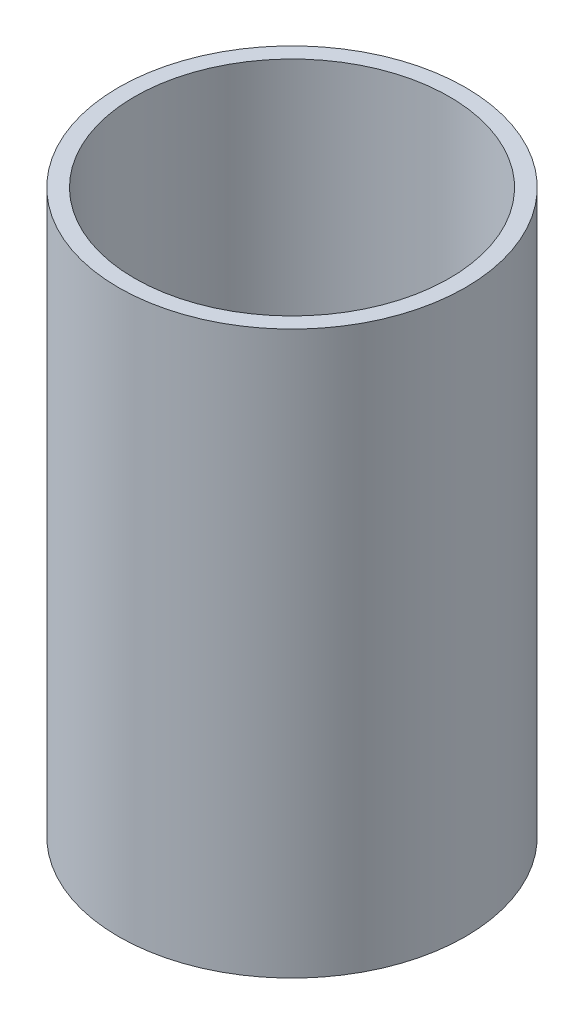
ISO-10303-21;
HEADER;
FILE_DESCRIPTION(('STEP AP214'),'2;1');
FILE_NAME('part.step','',(''),(''),'','','');
FILE_SCHEMA(('AUTOMOTIVE_DESIGN { 1 0 10303 214 1 1 1 1 }'));
ENDSEC;
DATA;
#1=APPLICATION_CONTEXT('core data for automotive mechanical design processes');
#2=APPLICATION_PROTOCOL_DEFINITION('international standard','automotive_design',2000,#1);
#3=PRODUCT_CONTEXT('',#1,'mechanical');
#4=PRODUCT('Part','Part','',(#3));
#5=PRODUCT_RELATED_PRODUCT_CATEGORY('part','',(#4));
#6=PRODUCT_DEFINITION_FORMATION('','',#4);
#7=PRODUCT_DEFINITION_CONTEXT('part definition',#1,'design');
#8=PRODUCT_DEFINITION('design','',#6,#7);
#9=PRODUCT_DEFINITION_SHAPE('','',#8);
#10=(LENGTH_UNIT() NAMED_UNIT(*) SI_UNIT(.MILLI.,.METRE.));
#11=(NAMED_UNIT(*) PLANE_ANGLE_UNIT() SI_UNIT($,.RADIAN.));
#12=(NAMED_UNIT(*) SI_UNIT($,.STERADIAN.) SOLID_ANGLE_UNIT());
#13=UNCERTAINTY_MEASURE_WITH_UNIT(LENGTH_MEASURE(1.E-05),#10,'distance_accuracy_value','');
#14=(GEOMETRIC_REPRESENTATION_CONTEXT(3) GLOBAL_UNCERTAINTY_ASSIGNED_CONTEXT((#13)) GLOBAL_UNIT_ASSIGNED_CONTEXT((#10,
#11,#12)) REPRESENTATION_CONTEXT('',''));
#15=CARTESIAN_POINT('',(0.,0.,0.));
#16=DIRECTION('',(0.,0.,1.));
#17=DIRECTION('',(1.,0.,0.));
#18=AXIS2_PLACEMENT_3D('',#15,#16,#17);
#19=CARTESIAN_POINT('',(0.,5.,0.));
#20=DIRECTION('',(0.,1.,0.));
#21=DIRECTION('',(0.,0.,1.));
#22=AXIS2_PLACEMENT_3D('',#19,#20,#21);
#23=PLANE('',#22);
#24=DIRECTION('',(0.,0.,1.));
#25=VECTOR('',#24,1.);
#26=CARTESIAN_POINT('',(5.25,5.,0.));
#27=LINE('',#26,#25);
#28=CARTESIAN_POINT('',(5.25,5.,-3.75));
#29=VERTEX_POINT('',#28);
#30=CARTESIAN_POINT('',(5.25,5.,-3.));
#31=VERTEX_POINT('',#30);
#32=EDGE_CURVE('E242',#29,#31,#27,.T.);
#33=ORIENTED_EDGE('',*,*,#32,.F.);
#34=DIRECTION('',(1.,0.,0.));
#35=VECTOR('',#34,1.);
#36=CARTESIAN_POINT('',(0.,5.,-3.75));
#37=LINE('',#36,#35);
#38=CARTESIAN_POINT('',(-5.25,5.,-3.75));
#39=VERTEX_POINT('',#38);
#40=EDGE_CURVE('E327',#39,#29,#37,.T.);
#41=ORIENTED_EDGE('',*,*,#40,.F.);
#42=DIRECTION('',(0.,0.,1.));
#43=VECTOR('',#42,1.);
#44=CARTESIAN_POINT('',(-5.25,5.,0.));
#45=LINE('',#44,#43);
#46=CARTESIAN_POINT('',(-5.25,5.,-3.));
#47=VERTEX_POINT('',#46);
#48=EDGE_CURVE('E11',#39,#47,#45,.T.);
#49=ORIENTED_EDGE('',*,*,#48,.T.);
#50=DIRECTION('',(1.,0.,0.));
#51=VECTOR('',#50,1.);
#52=CARTESIAN_POINT('',(0.,5.,-3.));
#53=LINE('',#52,#51);
#54=EDGE_CURVE('E207',#47,#31,#53,.T.);
#55=ORIENTED_EDGE('',*,*,#54,.T.);
#56=EDGE_LOOP('',(#33,#41,#49,#55));
#57=FACE_BOUND('',#56,.T.);
#58=ADVANCED_FACE('F35',(#57),#23,.T.);
#59=CARTESIAN_POINT('',(0.,5.,-3.));
#60=DIRECTION('',(0.,0.,-1.));
#61=DIRECTION('',(-1.,0.,0.));
#62=AXIS2_PLACEMENT_3D('',#59,#60,#61);
#63=PLANE('',#62);
#64=DIRECTION('',(1.,0.,0.));
#65=VECTOR('',#64,1.);
#66=CARTESIAN_POINT('',(0.,0.5,-3.));
#67=LINE('',#66,#65);
#68=CARTESIAN_POINT('',(2.35,0.5,-3.));
#69=VERTEX_POINT('',#68);
#70=CARTESIAN_POINT('',(6.5,0.5,-3.));
#71=VERTEX_POINT('',#70);
#72=EDGE_CURVE('E273',#69,#71,#67,.T.);
#73=ORIENTED_EDGE('',*,*,#72,.T.);
#74=DIRECTION('',(0.,-1.,0.));
#75=VECTOR('',#74,1.);
#76=CARTESIAN_POINT('',(6.5,5.,-3.));
#77=LINE('',#76,#75);
#78=CARTESIAN_POINT('',(6.5,20.,-3.));
#79=VERTEX_POINT('',#78);
#80=EDGE_CURVE('E343',#79,#71,#77,.T.);
#81=ORIENTED_EDGE('',*,*,#80,.F.);
#82=DIRECTION('',(1.,0.,0.));
#83=VECTOR('',#82,1.);
#84=CARTESIAN_POINT('',(0.,20.,-3.));
#85=LINE('',#84,#83);
#86=CARTESIAN_POINT('',(5.25,20.,-3.));
#87=VERTEX_POINT('',#86);
#88=EDGE_CURVE('E224',#87,#79,#85,.T.);
#89=ORIENTED_EDGE('',*,*,#88,.F.);
#90=DIRECTION('',(0.,-1.,0.));
#91=VECTOR('',#90,1.);
#92=CARTESIAN_POINT('',(5.25,20.,-3.));
#93=LINE('',#92,#91);
#94=EDGE_CURVE('E238',#87,#31,#93,.T.);
#95=ORIENTED_EDGE('',*,*,#94,.T.);
#96=ORIENTED_EDGE('',*,*,#54,.F.);
#97=DIRECTION('',(0.,-1.,0.));
#98=VECTOR('',#97,1.);
#99=CARTESIAN_POINT('',(-5.25,20.,-3.));
#100=LINE('',#99,#98);
#101=CARTESIAN_POINT('',(-5.25,20.,-3.));
#102=VERTEX_POINT('',#101);
#103=EDGE_CURVE('E50',#102,#47,#100,.T.);
#104=ORIENTED_EDGE('',*,*,#103,.F.);
#105=DIRECTION('',(1.,0.,0.));
#106=VECTOR('',#105,1.);
#107=CARTESIAN_POINT('',(0.,20.,-3.));
#108=LINE('',#107,#106);
#109=CARTESIAN_POINT('',(-6.5,20.,-3.));
#110=VERTEX_POINT('',#109);
#111=EDGE_CURVE('E262',#110,#102,#108,.T.);
#112=ORIENTED_EDGE('',*,*,#111,.F.);
#113=DIRECTION('',(0.,-1.,0.));
#114=VECTOR('',#113,1.);
#115=CARTESIAN_POINT('',(-6.5,5.,-3.));
#116=LINE('',#115,#114);
#117=CARTESIAN_POINT('',(-6.5,0.5,-3.));
#118=VERTEX_POINT('',#117);
#119=EDGE_CURVE('E346',#110,#118,#116,.T.);
#120=ORIENTED_EDGE('',*,*,#119,.T.);
#121=DIRECTION('',(1.,0.,0.));
#122=VECTOR('',#121,1.);
#123=CARTESIAN_POINT('',(0.,0.5,-3.));
#124=LINE('',#123,#122);
#125=CARTESIAN_POINT('',(-2.35,0.5,-3.));
#126=VERTEX_POINT('',#125);
#127=EDGE_CURVE('E283',#118,#126,#124,.T.);
#128=ORIENTED_EDGE('',*,*,#127,.T.);
#129=DIRECTION('',(0.,-1.,0.));
#130=VECTOR('',#129,1.);
#131=CARTESIAN_POINT('',(-2.35,0.5,-3.));
#132=LINE('',#131,#130);
#133=CARTESIAN_POINT('',(-2.35,0.,-3.));
#134=VERTEX_POINT('',#133);
#135=EDGE_CURVE('E293',#126,#134,#132,.T.);
#136=ORIENTED_EDGE('',*,*,#135,.T.);
#137=DIRECTION('',(1.,0.,0.));
#138=VECTOR('',#137,1.);
#139=CARTESIAN_POINT('',(0.,0.,-3.));
#140=LINE('',#139,#138);
#141=CARTESIAN_POINT('',(2.35,0.,-3.));
#142=VERTEX_POINT('',#141);
#143=EDGE_CURVE('E326',#134,#142,#140,.T.);
#144=ORIENTED_EDGE('',*,*,#143,.T.);
#145=DIRECTION('',(0.,-1.,0.));
#146=VECTOR('',#145,1.);
#147=CARTESIAN_POINT('',(2.35,0.5,-3.));
#148=LINE('',#147,#146);
#149=EDGE_CURVE('E280',#69,#142,#148,.T.);
#150=ORIENTED_EDGE('',*,*,#149,.F.);
#151=EDGE_LOOP('',(#73,#81,#89,#95,#96,#104,#112,#120,#128,#136,#144,#150));
#152=FACE_BOUND('',#151,.T.);
#153=ADVANCED_FACE('F410',(#152),#63,.F.);
#154=CARTESIAN_POINT('',(0.,35.,0.));
#155=DIRECTION('',(0.,-1.,0.));
#156=DIRECTION('',(0.,0.,-1.));
#157=AXIS2_PLACEMENT_3D('',#154,#155,#156);
#158=CYLINDRICAL_SURFACE('',#157,9.8);
#159=CARTESIAN_POINT('',(0.,1.,0.));
#160=DIRECTION('',(0.,1.,0.));
#161=DIRECTION('',(0.,0.,1.));
#162=AXIS2_PLACEMENT_3D('',#159,#160,#161);
#163=CIRCLE('',#162,9.8);
#164=CARTESIAN_POINT('',(0.,1.,9.8));
#165=VERTEX_POINT('',#164);
#166=EDGE_CURVE('E43',#165,#165,#163,.T.);
#167=ORIENTED_EDGE('',*,*,#166,.F.);
#168=EDGE_LOOP('',(#167));
#169=FACE_BOUND('',#168,.T.);
#170=CARTESIAN_POINT('',(0.,35.,0.));
#171=DIRECTION('',(0.,1.,0.));
#172=DIRECTION('',(0.,0.,1.));
#173=AXIS2_PLACEMENT_3D('',#170,#171,#172);
#174=CIRCLE('',#173,9.8);
#175=CARTESIAN_POINT('',(0.,35.,9.8));
#176=VERTEX_POINT('',#175);
#177=EDGE_CURVE('E395',#176,#176,#174,.T.);
#178=ORIENTED_EDGE('',*,*,#177,.T.);
#179=EDGE_LOOP('',(#178));
#180=FACE_BOUND('',#179,.T.);
#181=ADVANCED_FACE('F37',(#169,#180),#158,.F.);
#182=CARTESIAN_POINT('',(0.,35.,0.));
#183=DIRECTION('',(0.,-1.,0.));
#184=DIRECTION('',(0.,0.,-1.));
#185=AXIS2_PLACEMENT_3D('',#182,#183,#184);
#186=CYLINDRICAL_SURFACE('',#185,10.8);
#187=CARTESIAN_POINT('',(0.,35.,0.));
#188=DIRECTION('',(0.,1.,0.));
#189=DIRECTION('',(0.,0.,1.));
#190=AXIS2_PLACEMENT_3D('',#187,#188,#189);
#191=CIRCLE('',#190,10.8);
#192=CARTESIAN_POINT('',(0.,35.,10.8));
#193=VERTEX_POINT('',#192);
#194=EDGE_CURVE('E398',#193,#193,#191,.T.);
#195=ORIENTED_EDGE('',*,*,#194,.F.);
#196=EDGE_LOOP('',(#195));
#197=FACE_BOUND('',#196,.T.);
#198=CARTESIAN_POINT('',(0.,0.,0.));
#199=DIRECTION('',(0.,1.,0.));
#200=DIRECTION('',(0.,0.,1.));
#201=AXIS2_PLACEMENT_3D('',#198,#199,#200);
#202=CIRCLE('',#201,10.8);
#203=CARTESIAN_POINT('',(0.,0.,10.8));
#204=VERTEX_POINT('',#203);
#205=EDGE_CURVE('E394',#204,#204,#202,.T.);
#206=ORIENTED_EDGE('',*,*,#205,.T.);
#207=EDGE_LOOP('',(#206));
#208=FACE_BOUND('',#207,.T.);
#209=ADVANCED_FACE('F409',(#197,#208),#186,.T.);
#210=CARTESIAN_POINT('',(0.,35.,0.));
#211=DIRECTION('',(0.,1.,0.));
#212=DIRECTION('',(0.,0.,1.));
#213=AXIS2_PLACEMENT_3D('',#210,#211,#212);
#214=PLANE('',#213);
#215=ORIENTED_EDGE('',*,*,#177,.F.);
#216=EDGE_LOOP('',(#215));
#217=FACE_BOUND('',#216,.T.);
#218=ORIENTED_EDGE('',*,*,#194,.T.);
#219=EDGE_LOOP('',(#218));
#220=FACE_BOUND('',#219,.T.);
#221=ADVANCED_FACE('F413',(#217,#220),#214,.T.);
#222=CARTESIAN_POINT('',(0.,0.,0.));
#223=DIRECTION('',(0.,1.,0.));
#224=DIRECTION('',(0.,0.,1.));
#225=AXIS2_PLACEMENT_3D('',#222,#223,#224);
#226=PLANE('',#225);
#227=ORIENTED_EDGE('',*,*,#143,.F.);
#228=DIRECTION('',(0.,0.,1.));
#229=VECTOR('',#228,1.);
#230=CARTESIAN_POINT('',(-2.35,0.,0.));
#231=LINE('',#230,#229);
#232=CARTESIAN_POINT('',(-2.35,0.,1.));
#233=VERTEX_POINT('',#232);
#234=EDGE_CURVE('E367',#134,#233,#231,.T.);
#235=ORIENTED_EDGE('',*,*,#234,.T.);
#236=DIRECTION('',(1.,0.,0.));
#237=VECTOR('',#236,1.);
#238=CARTESIAN_POINT('',(0.,0.,1.));
#239=LINE('',#238,#237);
#240=CARTESIAN_POINT('',(2.35,0.,1.));
#241=VERTEX_POINT('',#240);
#242=EDGE_CURVE('E386',#233,#241,#239,.T.);
#243=ORIENTED_EDGE('',*,*,#242,.T.);
#244=DIRECTION('',(0.,0.,-1.));
#245=VECTOR('',#244,1.);
#246=CARTESIAN_POINT('',(2.35,0.,0.));
#247=LINE('',#246,#245);
#248=EDGE_CURVE('E364',#241,#142,#247,.T.);
#249=ORIENTED_EDGE('',*,*,#248,.T.);
#250=EDGE_LOOP('',(#227,#235,#243,#249));
#251=FACE_BOUND('',#250,.T.);
#252=ORIENTED_EDGE('',*,*,#205,.F.);
#253=EDGE_LOOP('',(#252));
#254=FACE_BOUND('',#253,.T.);
#255=ADVANCED_FACE('F416',(#251,#254),#226,.F.);
#256=CARTESIAN_POINT('',(2.35,1.,0.));
#257=DIRECTION('',(-1.,0.,0.));
#258=DIRECTION('',(0.,0.,1.));
#259=AXIS2_PLACEMENT_3D('',#256,#257,#258);
#260=PLANE('',#259);
#261=ORIENTED_EDGE('',*,*,#248,.F.);
#262=DIRECTION('',(0.,-1.,0.));
#263=VECTOR('',#262,1.);
#264=CARTESIAN_POINT('',(2.35,1.,1.));
#265=LINE('',#264,#263);
#266=CARTESIAN_POINT('',(2.35,1.,1.));
#267=VERTEX_POINT('',#266);
#268=EDGE_CURVE('E392',#267,#241,#265,.T.);
#269=ORIENTED_EDGE('',*,*,#268,.F.);
#270=DIRECTION('',(0.,0.,-1.));
#271=VECTOR('',#270,1.);
#272=CARTESIAN_POINT('',(2.35,1.,0.));
#273=LINE('',#272,#271);
#274=CARTESIAN_POINT('',(2.35,1.,0.));
#275=VERTEX_POINT('',#274);
#276=EDGE_CURVE('E371',#267,#275,#273,.T.);
#277=ORIENTED_EDGE('',*,*,#276,.T.);
#278=DIRECTION('',(0.,-1.,0.));
#279=VECTOR('',#278,1.);
#280=CARTESIAN_POINT('',(2.35,2.,0.));
#281=LINE('',#280,#279);
#282=CARTESIAN_POINT('',(2.35,2.,0.));
#283=VERTEX_POINT('',#282);
#284=EDGE_CURVE('E306',#283,#275,#281,.T.);
#285=ORIENTED_EDGE('',*,*,#284,.F.);
#286=DIRECTION('',(0.,0.,1.));
#287=VECTOR('',#286,1.);
#288=CARTESIAN_POINT('',(2.35,2.,0.));
#289=LINE('',#288,#287);
#290=CARTESIAN_POINT('',(2.35,2.,-0.750000000000001));
#291=VERTEX_POINT('',#290);
#292=EDGE_CURVE('E298',#291,#283,#289,.T.);
#293=ORIENTED_EDGE('',*,*,#292,.F.);
#294=DIRECTION('',(0.,-1.,0.));
#295=VECTOR('',#294,1.);
#296=CARTESIAN_POINT('',(2.35,2.,-0.750000000000001));
#297=LINE('',#296,#295);
#298=CARTESIAN_POINT('',(2.35,0.5,-0.750000000000001));
#299=VERTEX_POINT('',#298);
#300=EDGE_CURVE('E309',#291,#299,#297,.T.);
#301=ORIENTED_EDGE('',*,*,#300,.T.);
#302=DIRECTION('',(0.,0.,-1.));
#303=VECTOR('',#302,1.);
#304=CARTESIAN_POINT('',(2.35,0.5,0.));
#305=LINE('',#304,#303);
#306=EDGE_CURVE('E275',#299,#69,#305,.T.);
#307=ORIENTED_EDGE('',*,*,#306,.T.);
#308=ORIENTED_EDGE('',*,*,#149,.T.);
#309=EDGE_LOOP('',(#261,#269,#277,#285,#293,#301,#307,#308));
#310=FACE_BOUND('',#309,.T.);
#311=ADVANCED_FACE('F425',(#310),#260,.T.);
#312=CARTESIAN_POINT('',(0.,1.,1.));
#313=DIRECTION('',(0.,0.,-1.));
#314=DIRECTION('',(-1.,0.,0.));
#315=AXIS2_PLACEMENT_3D('',#312,#313,#314);
#316=PLANE('',#315);
#317=ORIENTED_EDGE('',*,*,#242,.F.);
#318=DIRECTION('',(0.,-1.,0.));
#319=VECTOR('',#318,1.);
#320=CARTESIAN_POINT('',(-2.35,1.,1.));
#321=LINE('',#320,#319);
#322=CARTESIAN_POINT('',(-2.35,1.,1.));
#323=VERTEX_POINT('',#322);
#324=EDGE_CURVE('E384',#323,#233,#321,.T.);
#325=ORIENTED_EDGE('',*,*,#324,.F.);
#326=DIRECTION('',(1.,0.,0.));
#327=VECTOR('',#326,1.);
#328=CARTESIAN_POINT('',(0.,1.,1.));
#329=LINE('',#328,#327);
#330=EDGE_CURVE('E374',#323,#267,#329,.T.);
#331=ORIENTED_EDGE('',*,*,#330,.T.);
#332=ORIENTED_EDGE('',*,*,#268,.T.);
#333=EDGE_LOOP('',(#317,#325,#331,#332));
#334=FACE_BOUND('',#333,.T.);
#335=ADVANCED_FACE('F431',(#334),#316,.T.);
#336=CARTESIAN_POINT('',(-2.35,1.,0.));
#337=DIRECTION('',(1.,0.,0.));
#338=DIRECTION('',(0.,0.,-1.));
#339=AXIS2_PLACEMENT_3D('',#336,#337,#338);
#340=PLANE('',#339);
#341=ORIENTED_EDGE('',*,*,#234,.F.);
#342=ORIENTED_EDGE('',*,*,#135,.F.);
#343=DIRECTION('',(0.,0.,-1.));
#344=VECTOR('',#343,1.);
#345=CARTESIAN_POINT('',(-2.35,0.5,0.));
#346=LINE('',#345,#344);
#347=CARTESIAN_POINT('',(-2.35,0.5,-0.75));
#348=VERTEX_POINT('',#347);
#349=EDGE_CURVE('E290',#348,#126,#346,.T.);
#350=ORIENTED_EDGE('',*,*,#349,.F.);
#351=DIRECTION('',(0.,-1.,0.));
#352=VECTOR('',#351,1.);
#353=CARTESIAN_POINT('',(-2.35,2.,-0.75));
#354=LINE('',#353,#352);
#355=CARTESIAN_POINT('',(-2.35,2.,-0.75));
#356=VERTEX_POINT('',#355);
#357=EDGE_CURVE('E57',#356,#348,#354,.T.);
#358=ORIENTED_EDGE('',*,*,#357,.F.);
#359=DIRECTION('',(0.,0.,1.));
#360=VECTOR('',#359,1.);
#361=CARTESIAN_POINT('',(-2.35,2.,0.));
#362=LINE('',#361,#360);
#363=CARTESIAN_POINT('',(-2.35,2.,0.));
#364=VERTEX_POINT('',#363);
#365=EDGE_CURVE('E317',#356,#364,#362,.T.);
#366=ORIENTED_EDGE('',*,*,#365,.T.);
#367=DIRECTION('',(0.,-1.,0.));
#368=VECTOR('',#367,1.);
#369=CARTESIAN_POINT('',(-2.35,2.,0.));
#370=LINE('',#369,#368);
#371=CARTESIAN_POINT('',(-2.35,1.,0.));
#372=VERTEX_POINT('',#371);
#373=EDGE_CURVE('E323',#364,#372,#370,.T.);
#374=ORIENTED_EDGE('',*,*,#373,.T.);
#375=DIRECTION('',(0.,0.,1.));
#376=VECTOR('',#375,1.);
#377=CARTESIAN_POINT('',(-2.35,1.,0.));
#378=LINE('',#377,#376);
#379=EDGE_CURVE('E377',#372,#323,#378,.T.);
#380=ORIENTED_EDGE('',*,*,#379,.T.);
#381=ORIENTED_EDGE('',*,*,#324,.T.);
#382=EDGE_LOOP('',(#341,#342,#350,#358,#366,#374,#380,#381));
#383=FACE_BOUND('',#382,.T.);
#384=ADVANCED_FACE('F489',(#383),#340,.T.);
#385=CARTESIAN_POINT('',(0.,1.,0.));
#386=DIRECTION('',(0.,1.,0.));
#387=DIRECTION('',(0.,0.,1.));
#388=AXIS2_PLACEMENT_3D('',#385,#386,#387);
#389=PLANE('',#388);
#390=DIRECTION('',(1.,0.,0.));
#391=VECTOR('',#390,1.);
#392=CARTESIAN_POINT('',(0.,1.,-3.75));
#393=LINE('',#392,#391);
#394=CARTESIAN_POINT('',(-7.25,1.,-3.75));
#395=VERTEX_POINT('',#394);
#396=CARTESIAN_POINT('',(7.25,1.,-3.75));
#397=VERTEX_POINT('',#396);
#398=EDGE_CURVE('E365',#395,#397,#393,.T.);
#399=ORIENTED_EDGE('',*,*,#398,.T.);
#400=DIRECTION('',(0.,0.,1.));
#401=VECTOR('',#400,1.);
#402=CARTESIAN_POINT('',(7.25,1.,0.));
#403=LINE('',#402,#401);
#404=CARTESIAN_POINT('',(7.25,1.,0.));
#405=VERTEX_POINT('',#404);
#406=EDGE_CURVE('E203',#397,#405,#403,.T.);
#407=ORIENTED_EDGE('',*,*,#406,.T.);
#408=DIRECTION('',(-1.,0.,0.));
#409=VECTOR('',#408,1.);
#410=CARTESIAN_POINT('',(0.,1.,0.));
#411=LINE('',#410,#409);
#412=EDGE_CURVE('E369',#405,#275,#411,.T.);
#413=ORIENTED_EDGE('',*,*,#412,.T.);
#414=ORIENTED_EDGE('',*,*,#276,.F.);
#415=ORIENTED_EDGE('',*,*,#330,.F.);
#416=ORIENTED_EDGE('',*,*,#379,.F.);
#417=DIRECTION('',(1.,0.,0.));
#418=VECTOR('',#417,1.);
#419=CARTESIAN_POINT('',(0.,1.,0.));
#420=LINE('',#419,#418);
#421=CARTESIAN_POINT('',(-7.25,1.,0.));
#422=VERTEX_POINT('',#421);
#423=EDGE_CURVE('E380',#422,#372,#420,.T.);
#424=ORIENTED_EDGE('',*,*,#423,.F.);
#425=DIRECTION('',(0.,0.,1.));
#426=VECTOR('',#425,1.);
#427=CARTESIAN_POINT('',(-7.25,1.,0.));
#428=LINE('',#427,#426);
#429=EDGE_CURVE('E382',#395,#422,#428,.T.);
#430=ORIENTED_EDGE('',*,*,#429,.F.);
#431=EDGE_LOOP('',(#399,#407,#413,#414,#415,#416,#424,#430));
#432=FACE_BOUND('',#431,.T.);
#433=ORIENTED_EDGE('',*,*,#166,.T.);
#434=EDGE_LOOP('',(#433));
#435=FACE_BOUND('',#434,.T.);
#436=ADVANCED_FACE('F405',(#432,#435),#389,.T.);
#437=CARTESIAN_POINT('',(0.,5.,-3.75));
#438=DIRECTION('',(0.,0.,-1.));
#439=DIRECTION('',(-1.,0.,0.));
#440=AXIS2_PLACEMENT_3D('',#437,#438,#439);
#441=PLANE('',#440);
#442=ORIENTED_EDGE('',*,*,#40,.T.);
#443=DIRECTION('',(0.,-1.,0.));
#444=VECTOR('',#443,1.);
#445=CARTESIAN_POINT('',(5.25,20.,-3.75));
#446=LINE('',#445,#444);
#447=CARTESIAN_POINT('',(5.25,20.,-3.75));
#448=VERTEX_POINT('',#447);
#449=EDGE_CURVE('E221',#448,#29,#446,.T.);
#450=ORIENTED_EDGE('',*,*,#449,.F.);
#451=DIRECTION('',(1.,0.,0.));
#452=VECTOR('',#451,1.);
#453=CARTESIAN_POINT('',(0.,20.,-3.75));
#454=LINE('',#453,#452);
#455=CARTESIAN_POINT('',(7.25,20.,-3.75));
#456=VERTEX_POINT('',#455);
#457=EDGE_CURVE('E213',#448,#456,#454,.T.);
#458=ORIENTED_EDGE('',*,*,#457,.T.);
#459=DIRECTION('',(0.,-1.,0.));
#460=VECTOR('',#459,1.);
#461=CARTESIAN_POINT('',(7.25,5.,-3.75));
#462=LINE('',#461,#460);
#463=EDGE_CURVE('E197',#456,#397,#462,.T.);
#464=ORIENTED_EDGE('',*,*,#463,.T.);
#465=ORIENTED_EDGE('',*,*,#398,.F.);
#466=DIRECTION('',(0.,-1.,0.));
#467=VECTOR('',#466,1.);
#468=CARTESIAN_POINT('',(-7.25,5.,-3.75));
#469=LINE('',#468,#467);
#470=CARTESIAN_POINT('',(-7.25,20.,-3.75));
#471=VERTEX_POINT('',#470);
#472=EDGE_CURVE('E361',#471,#395,#469,.T.);
#473=ORIENTED_EDGE('',*,*,#472,.F.);
#474=DIRECTION('',(1.,0.,0.));
#475=VECTOR('',#474,1.);
#476=CARTESIAN_POINT('',(0.,20.,-3.75));
#477=LINE('',#476,#475);
#478=CARTESIAN_POINT('',(-5.25,20.,-3.75));
#479=VERTEX_POINT('',#478);
#480=EDGE_CURVE('E244',#471,#479,#477,.T.);
#481=ORIENTED_EDGE('',*,*,#480,.T.);
#482=DIRECTION('',(0.,-1.,0.));
#483=VECTOR('',#482,1.);
#484=CARTESIAN_POINT('',(-5.25,20.,-3.75));
#485=LINE('',#484,#483);
#486=EDGE_CURVE('E266',#479,#39,#485,.T.);
#487=ORIENTED_EDGE('',*,*,#486,.T.);
#488=EDGE_LOOP('',(#442,#450,#458,#464,#465,#473,#481,#487));
#489=FACE_BOUND('',#488,.T.);
#490=ADVANCED_FACE('F220',(#489),#441,.T.);
#491=CARTESIAN_POINT('',(-7.25,5.,0.));
#492=DIRECTION('',(1.,0.,0.));
#493=DIRECTION('',(0.,0.,-1.));
#494=AXIS2_PLACEMENT_3D('',#491,#492,#493);
#495=PLANE('',#494);
#496=ORIENTED_EDGE('',*,*,#429,.T.);
#497=DIRECTION('',(0.,-1.,0.));
#498=VECTOR('',#497,1.);
#499=CARTESIAN_POINT('',(-7.25,5.,0.));
#500=LINE('',#499,#498);
#501=CARTESIAN_POINT('',(-7.25,20.,0.));
#502=VERTEX_POINT('',#501);
#503=EDGE_CURVE('E358',#502,#422,#500,.T.);
#504=ORIENTED_EDGE('',*,*,#503,.F.);
#505=DIRECTION('',(0.,0.,1.));
#506=VECTOR('',#505,1.);
#507=CARTESIAN_POINT('',(-7.25,20.,0.));
#508=LINE('',#507,#506);
#509=EDGE_CURVE('E247',#471,#502,#508,.T.);
#510=ORIENTED_EDGE('',*,*,#509,.F.);
#511=ORIENTED_EDGE('',*,*,#472,.T.);
#512=EDGE_LOOP('',(#496,#504,#510,#511));
#513=FACE_BOUND('',#512,.T.);
#514=ADVANCED_FACE('F480',(#513),#495,.F.);
#515=CARTESIAN_POINT('',(0.,5.,0.));
#516=DIRECTION('',(0.,0.,-1.));
#517=DIRECTION('',(-1.,0.,0.));
#518=AXIS2_PLACEMENT_3D('',#515,#516,#517);
#519=PLANE('',#518);
#520=DIRECTION('',(1.,0.,0.));
#521=VECTOR('',#520,1.);
#522=CARTESIAN_POINT('',(0.,2.,0.));
#523=LINE('',#522,#521);
#524=CARTESIAN_POINT('',(-5.25,2.,0.));
#525=VERTEX_POINT('',#524);
#526=EDGE_CURVE('E315',#525,#364,#523,.T.);
#527=ORIENTED_EDGE('',*,*,#526,.F.);
#528=DIRECTION('',(0.,-1.,0.));
#529=VECTOR('',#528,1.);
#530=CARTESIAN_POINT('',(-5.25,5.,0.));
#531=LINE('',#530,#529);
#532=CARTESIAN_POINT('',(-5.25,20.,0.));
#533=VERTEX_POINT('',#532);
#534=EDGE_CURVE('E355',#533,#525,#531,.T.);
#535=ORIENTED_EDGE('',*,*,#534,.F.);
#536=DIRECTION('',(1.,0.,0.));
#537=VECTOR('',#536,1.);
#538=CARTESIAN_POINT('',(0.,20.,0.));
#539=LINE('',#538,#537);
#540=EDGE_CURVE('E250',#502,#533,#539,.T.);
#541=ORIENTED_EDGE('',*,*,#540,.F.);
#542=ORIENTED_EDGE('',*,*,#503,.T.);
#543=ORIENTED_EDGE('',*,*,#423,.T.);
#544=ORIENTED_EDGE('',*,*,#373,.F.);
#545=EDGE_LOOP('',(#527,#535,#541,#542,#543,#544));
#546=FACE_BOUND('',#545,.T.);
#547=ADVANCED_FACE('F476',(#546),#519,.F.);
#548=CARTESIAN_POINT('',(-5.25,5.,0.));
#549=DIRECTION('',(1.,0.,0.));
#550=DIRECTION('',(0.,0.,-1.));
#551=AXIS2_PLACEMENT_3D('',#548,#549,#550);
#552=PLANE('',#551);
#553=DIRECTION('',(0.,0.,1.));
#554=VECTOR('',#553,1.);
#555=CARTESIAN_POINT('',(-5.25,2.,0.));
#556=LINE('',#555,#554);
#557=CARTESIAN_POINT('',(-5.25,2.,-0.75));
#558=VERTEX_POINT('',#557);
#559=EDGE_CURVE('E312',#558,#525,#556,.T.);
#560=ORIENTED_EDGE('',*,*,#559,.F.);
#561=DIRECTION('',(0.,-1.,0.));
#562=VECTOR('',#561,1.);
#563=CARTESIAN_POINT('',(-5.25,5.,-0.75));
#564=LINE('',#563,#562);
#565=CARTESIAN_POINT('',(-5.25,20.,-0.75));
#566=VERTEX_POINT('',#565);
#567=EDGE_CURVE('E352',#566,#558,#564,.T.);
#568=ORIENTED_EDGE('',*,*,#567,.F.);
#569=DIRECTION('',(0.,0.,1.));
#570=VECTOR('',#569,1.);
#571=CARTESIAN_POINT('',(-5.25,20.,0.));
#572=LINE('',#571,#570);
#573=EDGE_CURVE('E253',#566,#533,#572,.T.);
#574=ORIENTED_EDGE('',*,*,#573,.T.);
#575=ORIENTED_EDGE('',*,*,#534,.T.);
#576=EDGE_LOOP('',(#560,#568,#574,#575));
#577=FACE_BOUND('',#576,.T.);
#578=ADVANCED_FACE('F473',(#577),#552,.T.);
#579=CARTESIAN_POINT('',(0.,5.,-0.75));
#580=DIRECTION('',(0.,0.,1.));
#581=DIRECTION('',(1.,0.,0.));
#582=AXIS2_PLACEMENT_3D('',#579,#580,#581);
#583=PLANE('',#582);
#584=DIRECTION('',(-1.,0.,0.));
#585=VECTOR('',#584,1.);
#586=CARTESIAN_POINT('',(0.,0.5,-0.75));
#587=LINE('',#586,#585);
#588=CARTESIAN_POINT('',(-6.5,0.5,-0.749999999999999));
#589=VERTEX_POINT('',#588);
#590=EDGE_CURVE('E288',#348,#589,#587,.T.);
#591=ORIENTED_EDGE('',*,*,#590,.T.);
#592=DIRECTION('',(0.,-1.,0.));
#593=VECTOR('',#592,1.);
#594=CARTESIAN_POINT('',(-6.5,5.,-0.749999999999999));
#595=LINE('',#594,#593);
#596=CARTESIAN_POINT('',(-6.5,20.,-0.749999999999999));
#597=VERTEX_POINT('',#596);
#598=EDGE_CURVE('E349',#597,#589,#595,.T.);
#599=ORIENTED_EDGE('',*,*,#598,.F.);
#600=DIRECTION('',(-1.,0.,0.));
#601=VECTOR('',#600,1.);
#602=CARTESIAN_POINT('',(0.,20.,-0.75));
#603=LINE('',#602,#601);
#604=EDGE_CURVE('E256',#566,#597,#603,.T.);
#605=ORIENTED_EDGE('',*,*,#604,.F.);
#606=ORIENTED_EDGE('',*,*,#567,.T.);
#607=DIRECTION('',(-1.,0.,0.));
#608=VECTOR('',#607,1.);
#609=CARTESIAN_POINT('',(0.,2.,-0.75));
#610=LINE('',#609,#608);
#611=EDGE_CURVE('E320',#356,#558,#610,.T.);
#612=ORIENTED_EDGE('',*,*,#611,.F.);
#613=ORIENTED_EDGE('',*,*,#357,.T.);
#614=EDGE_LOOP('',(#591,#599,#605,#606,#612,#613));
#615=FACE_BOUND('',#614,.T.);
#616=ADVANCED_FACE('F469',(#615),#583,.F.);
#617=CARTESIAN_POINT('',(-6.5,5.,0.));
#618=DIRECTION('',(1.,0.,0.));
#619=DIRECTION('',(0.,0.,-1.));
#620=AXIS2_PLACEMENT_3D('',#617,#618,#619);
#621=PLANE('',#620);
#622=DIRECTION('',(0.,0.,1.));
#623=VECTOR('',#622,1.);
#624=CARTESIAN_POINT('',(-6.5,0.5,0.));
#625=LINE('',#624,#623);
#626=EDGE_CURVE('E285',#118,#589,#625,.T.);
#627=ORIENTED_EDGE('',*,*,#626,.F.);
#628=ORIENTED_EDGE('',*,*,#119,.F.);
#629=DIRECTION('',(0.,0.,1.));
#630=VECTOR('',#629,1.);
#631=CARTESIAN_POINT('',(-6.5,20.,0.));
#632=LINE('',#631,#630);
#633=EDGE_CURVE('E259',#110,#597,#632,.T.);
#634=ORIENTED_EDGE('',*,*,#633,.T.);
#635=ORIENTED_EDGE('',*,*,#598,.T.);
#636=EDGE_LOOP('',(#627,#628,#634,#635));
#637=FACE_BOUND('',#636,.T.);
#638=ADVANCED_FACE('F464',(#637),#621,.T.);
#639=CARTESIAN_POINT('',(6.5,5.,0.));
#640=DIRECTION('',(1.,0.,0.));
#641=DIRECTION('',(0.,0.,-1.));
#642=AXIS2_PLACEMENT_3D('',#639,#640,#641);
#643=PLANE('',#642);
#644=ORIENTED_EDGE('',*,*,#80,.T.);
#645=DIRECTION('',(0.,0.,1.));
#646=VECTOR('',#645,1.);
#647=CARTESIAN_POINT('',(6.5,0.5,0.));
#648=LINE('',#647,#646);
#649=CARTESIAN_POINT('',(6.5,0.5,-0.750000000000001));
#650=VERTEX_POINT('',#649);
#651=EDGE_CURVE('E270',#71,#650,#648,.T.);
#652=ORIENTED_EDGE('',*,*,#651,.T.);
#653=DIRECTION('',(0.,-1.,0.));
#654=VECTOR('',#653,1.);
#655=CARTESIAN_POINT('',(6.5,5.,-0.750000000000001));
#656=LINE('',#655,#654);
#657=CARTESIAN_POINT('',(6.5,20.,-0.750000000000001));
#658=VERTEX_POINT('',#657);
#659=EDGE_CURVE('E340',#658,#650,#656,.T.);
#660=ORIENTED_EDGE('',*,*,#659,.F.);
#661=DIRECTION('',(0.,0.,1.));
#662=VECTOR('',#661,1.);
#663=CARTESIAN_POINT('',(6.5,20.,0.));
#664=LINE('',#663,#662);
#665=EDGE_CURVE('E229',#79,#658,#664,.T.);
#666=ORIENTED_EDGE('',*,*,#665,.F.);
#667=EDGE_LOOP('',(#644,#652,#660,#666));
#668=FACE_BOUND('',#667,.T.);
#669=ADVANCED_FACE('F461',(#668),#643,.F.);
#670=CARTESIAN_POINT('',(0.,5.,-0.750000000000001));
#671=DIRECTION('',(0.,0.,-1.));
#672=DIRECTION('',(-1.,0.,0.));
#673=AXIS2_PLACEMENT_3D('',#670,#671,#672);
#674=PLANE('',#673);
#675=ORIENTED_EDGE('',*,*,#659,.T.);
#676=DIRECTION('',(1.,0.,0.));
#677=VECTOR('',#676,1.);
#678=CARTESIAN_POINT('',(0.,0.5,-0.750000000000001));
#679=LINE('',#678,#677);
#680=EDGE_CURVE('E278',#299,#650,#679,.T.);
#681=ORIENTED_EDGE('',*,*,#680,.F.);
#682=ORIENTED_EDGE('',*,*,#300,.F.);
#683=DIRECTION('',(1.,0.,0.));
#684=VECTOR('',#683,1.);
#685=CARTESIAN_POINT('',(0.,2.,-0.750000000000001));
#686=LINE('',#685,#684);
#687=CARTESIAN_POINT('',(5.25,2.,-0.750000000000001));
#688=VERTEX_POINT('',#687);
#689=EDGE_CURVE('E296',#291,#688,#686,.T.);
#690=ORIENTED_EDGE('',*,*,#689,.T.);
#691=DIRECTION('',(0.,-1.,0.));
#692=VECTOR('',#691,1.);
#693=CARTESIAN_POINT('',(5.25,5.,-0.750000000000001));
#694=LINE('',#693,#692);
#695=CARTESIAN_POINT('',(5.25,20.,-0.750000000000001));
#696=VERTEX_POINT('',#695);
#697=EDGE_CURVE('E337',#696,#688,#694,.T.);
#698=ORIENTED_EDGE('',*,*,#697,.F.);
#699=DIRECTION('',(1.,0.,0.));
#700=VECTOR('',#699,1.);
#701=CARTESIAN_POINT('',(0.,20.,-0.750000000000001));
#702=LINE('',#701,#700);
#703=EDGE_CURVE('E232',#696,#658,#702,.T.);
#704=ORIENTED_EDGE('',*,*,#703,.T.);
#705=EDGE_LOOP('',(#675,#681,#682,#690,#698,#704));
#706=FACE_BOUND('',#705,.T.);
#707=ADVANCED_FACE('F457',(#706),#674,.T.);
#708=CARTESIAN_POINT('',(5.25,5.,0.));
#709=DIRECTION('',(1.,0.,0.));
#710=DIRECTION('',(0.,0.,-1.));
#711=AXIS2_PLACEMENT_3D('',#708,#709,#710);
#712=PLANE('',#711);
#713=ORIENTED_EDGE('',*,*,#697,.T.);
#714=DIRECTION('',(0.,0.,1.));
#715=VECTOR('',#714,1.);
#716=CARTESIAN_POINT('',(5.25,2.,0.));
#717=LINE('',#716,#715);
#718=CARTESIAN_POINT('',(5.25,2.,0.));
#719=VERTEX_POINT('',#718);
#720=EDGE_CURVE('E303',#688,#719,#717,.T.);
#721=ORIENTED_EDGE('',*,*,#720,.T.);
#722=DIRECTION('',(0.,-1.,0.));
#723=VECTOR('',#722,1.);
#724=CARTESIAN_POINT('',(5.25,5.,0.));
#725=LINE('',#724,#723);
#726=CARTESIAN_POINT('',(5.25,20.,0.));
#727=VERTEX_POINT('',#726);
#728=EDGE_CURVE('E334',#727,#719,#725,.T.);
#729=ORIENTED_EDGE('',*,*,#728,.F.);
#730=DIRECTION('',(0.,0.,1.));
#731=VECTOR('',#730,1.);
#732=CARTESIAN_POINT('',(5.25,20.,0.));
#733=LINE('',#732,#731);
#734=EDGE_CURVE('E235',#696,#727,#733,.T.);
#735=ORIENTED_EDGE('',*,*,#734,.F.);
#736=EDGE_LOOP('',(#713,#721,#729,#735));
#737=FACE_BOUND('',#736,.T.);
#738=ADVANCED_FACE('F453',(#737),#712,.F.);
#739=CARTESIAN_POINT('',(0.,5.,0.));
#740=DIRECTION('',(0.,0.,1.));
#741=DIRECTION('',(1.,0.,0.));
#742=AXIS2_PLACEMENT_3D('',#739,#740,#741);
#743=PLANE('',#742);
#744=ORIENTED_EDGE('',*,*,#728,.T.);
#745=DIRECTION('',(-1.,0.,0.));
#746=VECTOR('',#745,1.);
#747=CARTESIAN_POINT('',(0.,2.,0.));
#748=LINE('',#747,#746);
#749=EDGE_CURVE('E300',#719,#283,#748,.T.);
#750=ORIENTED_EDGE('',*,*,#749,.T.);
#751=ORIENTED_EDGE('',*,*,#284,.T.);
#752=ORIENTED_EDGE('',*,*,#412,.F.);
#753=DIRECTION('',(0.,-1.,0.));
#754=VECTOR('',#753,1.);
#755=CARTESIAN_POINT('',(7.25,5.,0.));
#756=LINE('',#755,#754);
#757=CARTESIAN_POINT('',(7.25,20.,0.));
#758=VERTEX_POINT('',#757);
#759=EDGE_CURVE('E206',#758,#405,#756,.T.);
#760=ORIENTED_EDGE('',*,*,#759,.F.);
#761=DIRECTION('',(-1.,0.,0.));
#762=VECTOR('',#761,1.);
#763=CARTESIAN_POINT('',(0.,20.,0.));
#764=LINE('',#763,#762);
#765=EDGE_CURVE('E217',#758,#727,#764,.T.);
#766=ORIENTED_EDGE('',*,*,#765,.T.);
#767=EDGE_LOOP('',(#744,#750,#751,#752,#760,#766));
#768=FACE_BOUND('',#767,.T.);
#769=ADVANCED_FACE('F450',(#768),#743,.T.);
#770=CARTESIAN_POINT('',(7.25,5.,0.));
#771=DIRECTION('',(1.,0.,0.));
#772=DIRECTION('',(0.,0.,-1.));
#773=AXIS2_PLACEMENT_3D('',#770,#771,#772);
#774=PLANE('',#773);
#775=ORIENTED_EDGE('',*,*,#759,.T.);
#776=ORIENTED_EDGE('',*,*,#406,.F.);
#777=ORIENTED_EDGE('',*,*,#463,.F.);
#778=DIRECTION('',(0.,0.,1.));
#779=VECTOR('',#778,1.);
#780=CARTESIAN_POINT('',(7.25,20.,0.));
#781=LINE('',#780,#779);
#782=EDGE_CURVE('E200',#456,#758,#781,.T.);
#783=ORIENTED_EDGE('',*,*,#782,.T.);
#784=EDGE_LOOP('',(#775,#776,#777,#783));
#785=FACE_BOUND('',#784,.T.);
#786=ADVANCED_FACE('F199',(#785),#774,.T.);
#787=CARTESIAN_POINT('',(0.,2.,0.));
#788=DIRECTION('',(0.,1.,0.));
#789=DIRECTION('',(0.,0.,1.));
#790=AXIS2_PLACEMENT_3D('',#787,#788,#789);
#791=PLANE('',#790);
#792=ORIENTED_EDGE('',*,*,#559,.T.);
#793=ORIENTED_EDGE('',*,*,#526,.T.);
#794=ORIENTED_EDGE('',*,*,#365,.F.);
#795=ORIENTED_EDGE('',*,*,#611,.T.);
#796=EDGE_LOOP('',(#792,#793,#794,#795));
#797=FACE_BOUND('',#796,.T.);
#798=ADVANCED_FACE('F446',(#797),#791,.T.);
#799=CARTESIAN_POINT('',(0.,2.,0.));
#800=DIRECTION('',(0.,1.,0.));
#801=DIRECTION('',(0.,0.,1.));
#802=AXIS2_PLACEMENT_3D('',#799,#800,#801);
#803=PLANE('',#802);
#804=ORIENTED_EDGE('',*,*,#689,.F.);
#805=ORIENTED_EDGE('',*,*,#292,.T.);
#806=ORIENTED_EDGE('',*,*,#749,.F.);
#807=ORIENTED_EDGE('',*,*,#720,.F.);
#808=EDGE_LOOP('',(#804,#805,#806,#807));
#809=FACE_BOUND('',#808,.T.);
#810=ADVANCED_FACE('F540',(#809),#803,.T.);
#811=CARTESIAN_POINT('',(0.,0.5,0.));
#812=DIRECTION('',(0.,1.,0.));
#813=DIRECTION('',(0.,0.,1.));
#814=AXIS2_PLACEMENT_3D('',#811,#812,#813);
#815=PLANE('',#814);
#816=ORIENTED_EDGE('',*,*,#127,.F.);
#817=ORIENTED_EDGE('',*,*,#626,.T.);
#818=ORIENTED_EDGE('',*,*,#590,.F.);
#819=ORIENTED_EDGE('',*,*,#349,.T.);
#820=EDGE_LOOP('',(#816,#817,#818,#819));
#821=FACE_BOUND('',#820,.T.);
#822=ADVANCED_FACE('F515',(#821),#815,.T.);
#823=CARTESIAN_POINT('',(0.,0.5,0.));
#824=DIRECTION('',(0.,1.,0.));
#825=DIRECTION('',(0.,0.,1.));
#826=AXIS2_PLACEMENT_3D('',#823,#824,#825);
#827=PLANE('',#826);
#828=ORIENTED_EDGE('',*,*,#651,.F.);
#829=ORIENTED_EDGE('',*,*,#72,.F.);
#830=ORIENTED_EDGE('',*,*,#306,.F.);
#831=ORIENTED_EDGE('',*,*,#680,.T.);
#832=EDGE_LOOP('',(#828,#829,#830,#831));
#833=FACE_BOUND('',#832,.T.);
#834=ADVANCED_FACE('F546',(#833),#827,.T.);
#835=CARTESIAN_POINT('',(-5.25,20.,0.));
#836=DIRECTION('',(-1.,0.,0.));
#837=DIRECTION('',(0.,0.,1.));
#838=AXIS2_PLACEMENT_3D('',#835,#836,#837);
#839=PLANE('',#838);
#840=ORIENTED_EDGE('',*,*,#48,.F.);
#841=ORIENTED_EDGE('',*,*,#486,.F.);
#842=DIRECTION('',(0.,0.,-1.));
#843=VECTOR('',#842,1.);
#844=CARTESIAN_POINT('',(-5.25,20.,0.));
#845=LINE('',#844,#843);
#846=EDGE_CURVE('E264',#102,#479,#845,.T.);
#847=ORIENTED_EDGE('',*,*,#846,.F.);
#848=ORIENTED_EDGE('',*,*,#103,.T.);
#849=EDGE_LOOP('',(#840,#841,#847,#848));
#850=FACE_BOUND('',#849,.T.);
#851=ADVANCED_FACE('F551',(#850),#839,.F.);
#852=CARTESIAN_POINT('',(0.,20.,0.));
#853=DIRECTION('',(0.,1.,0.));
#854=DIRECTION('',(0.,0.,1.));
#855=AXIS2_PLACEMENT_3D('',#852,#853,#854);
#856=PLANE('',#855);
#857=ORIENTED_EDGE('',*,*,#480,.F.);
#858=ORIENTED_EDGE('',*,*,#509,.T.);
#859=ORIENTED_EDGE('',*,*,#540,.T.);
#860=ORIENTED_EDGE('',*,*,#573,.F.);
#861=ORIENTED_EDGE('',*,*,#604,.T.);
#862=ORIENTED_EDGE('',*,*,#633,.F.);
#863=ORIENTED_EDGE('',*,*,#111,.T.);
#864=ORIENTED_EDGE('',*,*,#846,.T.);
#865=EDGE_LOOP('',(#857,#858,#859,#860,#861,#862,#863,#864));
#866=FACE_BOUND('',#865,.T.);
#867=ADVANCED_FACE('F524',(#866),#856,.T.);
#868=CARTESIAN_POINT('',(5.25,20.,0.));
#869=DIRECTION('',(-1.,0.,0.));
#870=DIRECTION('',(0.,0.,1.));
#871=AXIS2_PLACEMENT_3D('',#868,#869,#870);
#872=PLANE('',#871);
#873=ORIENTED_EDGE('',*,*,#449,.T.);
#874=ORIENTED_EDGE('',*,*,#32,.T.);
#875=ORIENTED_EDGE('',*,*,#94,.F.);
#876=DIRECTION('',(0.,0.,-1.));
#877=VECTOR('',#876,1.);
#878=CARTESIAN_POINT('',(5.25,20.,0.));
#879=LINE('',#878,#877);
#880=EDGE_CURVE('E222',#87,#448,#879,.T.);
#881=ORIENTED_EDGE('',*,*,#880,.T.);
#882=EDGE_LOOP('',(#873,#874,#875,#881));
#883=FACE_BOUND('',#882,.T.);
#884=ADVANCED_FACE('F530',(#883),#872,.T.);
#885=CARTESIAN_POINT('',(0.,20.,0.));
#886=DIRECTION('',(0.,1.,0.));
#887=DIRECTION('',(0.,0.,1.));
#888=AXIS2_PLACEMENT_3D('',#885,#886,#887);
#889=PLANE('',#888);
#890=ORIENTED_EDGE('',*,*,#782,.F.);
#891=ORIENTED_EDGE('',*,*,#457,.F.);
#892=ORIENTED_EDGE('',*,*,#880,.F.);
#893=ORIENTED_EDGE('',*,*,#88,.T.);
#894=ORIENTED_EDGE('',*,*,#665,.T.);
#895=ORIENTED_EDGE('',*,*,#703,.F.);
#896=ORIENTED_EDGE('',*,*,#734,.T.);
#897=ORIENTED_EDGE('',*,*,#765,.F.);
#898=EDGE_LOOP('',(#890,#891,#892,#893,#894,#895,#896,#897));
#899=FACE_BOUND('',#898,.T.);
#900=ADVANCED_FACE('F211',(#899),#889,.T.);
#901=CLOSED_SHELL('',(#58,#153,#181,#209,#221,#255,#311,#335,#384,#436,#490,#514,#547,#578,#616,
#638,#669,#707,#738,#769,#786,#798,#810,#822,#834,#851,#867,#884,#900));
#902=MANIFOLD_SOLID_BREP('B2',#901);
#903=ADVANCED_BREP_SHAPE_REPRESENTATION('',(#18,#902),#14);
#904=SHAPE_DEFINITION_REPRESENTATION(#9,#903);
ENDSEC;
END-ISO-10303-21;
